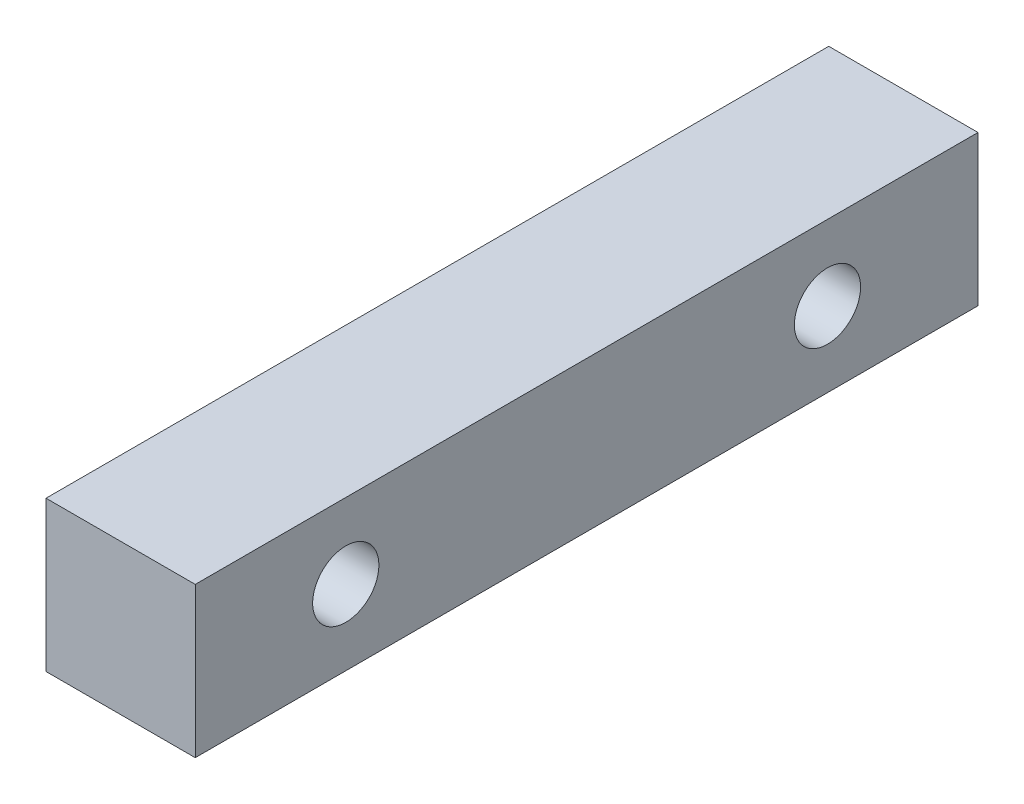
ISO-10303-21;
HEADER;
FILE_DESCRIPTION(('STEP AP214'),'2;1');
FILE_NAME('part.step','',(''),(''),'','','');
FILE_SCHEMA(('AUTOMOTIVE_DESIGN { 1 0 10303 214 1 1 1 1 }'));
ENDSEC;
DATA;
#1=APPLICATION_CONTEXT('core data for automotive mechanical design processes');
#2=APPLICATION_PROTOCOL_DEFINITION('international standard','automotive_design',2000,#1);
#3=PRODUCT_CONTEXT('',#1,'mechanical');
#4=PRODUCT('Part','Part','',(#3));
#5=PRODUCT_RELATED_PRODUCT_CATEGORY('part','',(#4));
#6=PRODUCT_DEFINITION_FORMATION('','',#4);
#7=PRODUCT_DEFINITION_CONTEXT('part definition',#1,'design');
#8=PRODUCT_DEFINITION('design','',#6,#7);
#9=PRODUCT_DEFINITION_SHAPE('','',#8);
#10=(LENGTH_UNIT() NAMED_UNIT(*) SI_UNIT(.MILLI.,.METRE.));
#11=(NAMED_UNIT(*) PLANE_ANGLE_UNIT() SI_UNIT($,.RADIAN.));
#12=(NAMED_UNIT(*) SI_UNIT($,.STERADIAN.) SOLID_ANGLE_UNIT());
#13=UNCERTAINTY_MEASURE_WITH_UNIT(LENGTH_MEASURE(1.E-05),#10,'distance_accuracy_value','');
#14=(GEOMETRIC_REPRESENTATION_CONTEXT(3) GLOBAL_UNCERTAINTY_ASSIGNED_CONTEXT((#13)) GLOBAL_UNIT_ASSIGNED_CONTEXT((#10,
#11,#12)) REPRESENTATION_CONTEXT('',''));
#15=CARTESIAN_POINT('',(0.,0.,0.));
#16=DIRECTION('',(0.,0.,1.));
#17=DIRECTION('',(1.,0.,0.));
#18=AXIS2_PLACEMENT_3D('',#15,#16,#17);
#19=CARTESIAN_POINT('',(0.,0.,-65.));
#20=DIRECTION('',(0.,0.,-1.));
#21=DIRECTION('',(-1.,0.,0.));
#22=AXIS2_PLACEMENT_3D('',#19,#20,#21);
#23=PLANE('',#22);
#24=DIRECTION('',(0.,-1.,0.));
#25=VECTOR('',#24,1.);
#26=CARTESIAN_POINT('',(-42.4,120.65,-65.));
#27=LINE('',#26,#25);
#28=CARTESIAN_POINT('',(-42.4,120.65,-65.));
#29=VERTEX_POINT('',#28);
#30=CARTESIAN_POINT('',(-42.4,108.185446869956,-65.));
#31=VERTEX_POINT('',#30);
#32=EDGE_CURVE('E46',#29,#31,#27,.T.);
#33=ORIENTED_EDGE('',*,*,#32,.F.);
#34=DIRECTION('',(-1.,0.,0.));
#35=VECTOR('',#34,1.);
#36=CARTESIAN_POINT('',(-42.4,120.65,-65.));
#37=LINE('',#36,#35);
#38=CARTESIAN_POINT('',(-30.0057262482,120.65,-65.));
#39=VERTEX_POINT('',#38);
#40=EDGE_CURVE('E70',#39,#29,#37,.T.);
#41=ORIENTED_EDGE('',*,*,#40,.F.);
#42=DIRECTION('',(0.,1.,0.));
#43=VECTOR('',#42,1.);
#44=CARTESIAN_POINT('',(-30.0057262482,120.65,-65.));
#45=LINE('',#44,#43);
#46=CARTESIAN_POINT('',(-30.0057262482,108.185446869956,-65.));
#47=VERTEX_POINT('',#46);
#48=EDGE_CURVE('E75',#47,#39,#45,.T.);
#49=ORIENTED_EDGE('',*,*,#48,.F.);
#50=DIRECTION('',(1.,0.,0.));
#51=VECTOR('',#50,1.);
#52=CARTESIAN_POINT('',(-42.4,108.185446869956,-65.));
#53=LINE('',#52,#51);
#54=EDGE_CURVE('E90',#31,#47,#53,.T.);
#55=ORIENTED_EDGE('',*,*,#54,.F.);
#56=EDGE_LOOP('',(#33,#41,#49,#55));
#57=FACE_BOUND('',#56,.T.);
#58=ADVANCED_FACE('F37',(#57),#23,.T.);
#59=CARTESIAN_POINT('',(0.,0.,0.));
#60=DIRECTION('',(0.,0.,1.));
#61=DIRECTION('',(1.,0.,0.));
#62=AXIS2_PLACEMENT_3D('',#59,#60,#61);
#63=PLANE('',#62);
#64=DIRECTION('',(0.,-1.,0.));
#65=VECTOR('',#64,1.);
#66=CARTESIAN_POINT('',(-42.4,120.65,0.));
#67=LINE('',#66,#65);
#68=CARTESIAN_POINT('',(-42.4,120.65,0.));
#69=VERTEX_POINT('',#68);
#70=CARTESIAN_POINT('',(-42.4,108.185446869956,0.));
#71=VERTEX_POINT('',#70);
#72=EDGE_CURVE('E100',#69,#71,#67,.T.);
#73=ORIENTED_EDGE('',*,*,#72,.T.);
#74=DIRECTION('',(1.,0.,0.));
#75=VECTOR('',#74,1.);
#76=CARTESIAN_POINT('',(-42.4,108.185446869956,0.));
#77=LINE('',#76,#75);
#78=CARTESIAN_POINT('',(-30.0057262482,108.185446869956,0.));
#79=VERTEX_POINT('',#78);
#80=EDGE_CURVE('E88',#71,#79,#77,.T.);
#81=ORIENTED_EDGE('',*,*,#80,.T.);
#82=DIRECTION('',(0.,1.,0.));
#83=VECTOR('',#82,1.);
#84=CARTESIAN_POINT('',(-30.0057262482,120.65,0.));
#85=LINE('',#84,#83);
#86=CARTESIAN_POINT('',(-30.0057262482,120.65,0.));
#87=VERTEX_POINT('',#86);
#88=EDGE_CURVE('E92',#79,#87,#85,.T.);
#89=ORIENTED_EDGE('',*,*,#88,.T.);
#90=DIRECTION('',(-1.,0.,0.));
#91=VECTOR('',#90,1.);
#92=CARTESIAN_POINT('',(-42.4,120.65,0.));
#93=LINE('',#92,#91);
#94=EDGE_CURVE('E97',#87,#69,#93,.T.);
#95=ORIENTED_EDGE('',*,*,#94,.T.);
#96=EDGE_LOOP('',(#73,#81,#89,#95));
#97=FACE_BOUND('',#96,.T.);
#98=ADVANCED_FACE('F99',(#97),#63,.T.);
#99=CARTESIAN_POINT('',(-42.4,108.185446869956,-82.577915307745));
#100=DIRECTION('',(0.,-1.,0.));
#101=DIRECTION('',(0.,0.,-1.));
#102=AXIS2_PLACEMENT_3D('',#99,#100,#101);
#103=PLANE('',#102);
#104=DIRECTION('',(0.,0.,1.));
#105=VECTOR('',#104,1.);
#106=CARTESIAN_POINT('',(-42.4,108.185446869956,-82.577915307745));
#107=LINE('',#106,#105);
#108=EDGE_CURVE('E11',#31,#71,#107,.T.);
#109=ORIENTED_EDGE('',*,*,#108,.F.);
#110=ORIENTED_EDGE('',*,*,#54,.T.);
#111=DIRECTION('',(0.,0.,1.));
#112=VECTOR('',#111,1.);
#113=CARTESIAN_POINT('',(-30.0057262482,108.185446869956,-82.577915307745));
#114=LINE('',#113,#112);
#115=EDGE_CURVE('E85',#47,#79,#114,.T.);
#116=ORIENTED_EDGE('',*,*,#115,.T.);
#117=ORIENTED_EDGE('',*,*,#80,.F.);
#118=EDGE_LOOP('',(#109,#110,#116,#117));
#119=FACE_BOUND('',#118,.T.);
#120=ADVANCED_FACE('F86',(#119),#103,.T.);
#121=CARTESIAN_POINT('',(-30.0057262482,120.65,-82.577915307745));
#122=DIRECTION('',(1.,0.,0.));
#123=DIRECTION('',(0.,0.,-1.));
#124=AXIS2_PLACEMENT_3D('',#121,#122,#123);
#125=PLANE('',#124);
#126=CARTESIAN_POINT('',(-30.0057262482,114.417723434978,-52.5));
#127=DIRECTION('',(1.,0.,0.));
#128=DIRECTION('',(0.,0.,-1.));
#129=AXIS2_PLACEMENT_3D('',#126,#127,#128);
#130=CIRCLE('',#129,2.75);
#131=CARTESIAN_POINT('',(-30.0057262482,114.417723434978,-55.25));
#132=VERTEX_POINT('',#131);
#133=EDGE_CURVE('E102',#132,#132,#130,.F.);
#134=ORIENTED_EDGE('',*,*,#133,.T.);
#135=EDGE_LOOP('',(#134));
#136=FACE_BOUND('',#135,.T.);
#137=CARTESIAN_POINT('',(-30.0057262482,114.417723434978,-12.5));
#138=DIRECTION('',(1.,0.,0.));
#139=DIRECTION('',(0.,0.,-1.));
#140=AXIS2_PLACEMENT_3D('',#137,#138,#139);
#141=CIRCLE('',#140,2.75);
#142=CARTESIAN_POINT('',(-30.0057262482,114.417723434978,-15.25));
#143=VERTEX_POINT('',#142);
#144=EDGE_CURVE('E114',#143,#143,#141,.F.);
#145=ORIENTED_EDGE('',*,*,#144,.T.);
#146=EDGE_LOOP('',(#145));
#147=FACE_BOUND('',#146,.T.);
#148=ORIENTED_EDGE('',*,*,#115,.F.);
#149=ORIENTED_EDGE('',*,*,#48,.T.);
#150=DIRECTION('',(0.,0.,1.));
#151=VECTOR('',#150,1.);
#152=CARTESIAN_POINT('',(-30.0057262482,120.65,-82.577915307745));
#153=LINE('',#152,#151);
#154=EDGE_CURVE('E80',#39,#87,#153,.T.);
#155=ORIENTED_EDGE('',*,*,#154,.T.);
#156=ORIENTED_EDGE('',*,*,#88,.F.);
#157=EDGE_LOOP('',(#148,#149,#155,#156));
#158=FACE_BOUND('',#157,.T.);
#159=ADVANCED_FACE('F93',(#136,#147,#158),#125,.T.);
#160=CARTESIAN_POINT('',(-42.4,120.65,-82.577915307745));
#161=DIRECTION('',(0.,1.,0.));
#162=DIRECTION('',(0.,0.,1.));
#163=AXIS2_PLACEMENT_3D('',#160,#161,#162);
#164=PLANE('',#163);
#165=ORIENTED_EDGE('',*,*,#154,.F.);
#166=ORIENTED_EDGE('',*,*,#40,.T.);
#167=DIRECTION('',(0.,0.,1.));
#168=VECTOR('',#167,1.);
#169=CARTESIAN_POINT('',(-42.4,120.65,-82.577915307745));
#170=LINE('',#169,#168);
#171=EDGE_CURVE('E108',#29,#69,#170,.T.);
#172=ORIENTED_EDGE('',*,*,#171,.T.);
#173=ORIENTED_EDGE('',*,*,#94,.F.);
#174=EDGE_LOOP('',(#165,#166,#172,#173));
#175=FACE_BOUND('',#174,.T.);
#176=ADVANCED_FACE('F125',(#175),#164,.T.);
#177=CARTESIAN_POINT('',(-42.4,120.65,-82.577915307745));
#178=DIRECTION('',(-1.,0.,0.));
#179=DIRECTION('',(0.,0.,1.));
#180=AXIS2_PLACEMENT_3D('',#177,#178,#179);
#181=PLANE('',#180);
#182=CARTESIAN_POINT('',(-42.4,114.417723434978,-52.5));
#183=DIRECTION('',(-1.,0.,0.));
#184=DIRECTION('',(0.,0.,1.));
#185=AXIS2_PLACEMENT_3D('',#182,#183,#184);
#186=CIRCLE('',#185,2.75);
#187=CARTESIAN_POINT('',(-42.4,114.417723434978,-49.75));
#188=VERTEX_POINT('',#187);
#189=EDGE_CURVE('E40',#188,#188,#186,.F.);
#190=ORIENTED_EDGE('',*,*,#189,.T.);
#191=EDGE_LOOP('',(#190));
#192=FACE_BOUND('',#191,.T.);
#193=CARTESIAN_POINT('',(-42.4,114.417723434978,-12.5));
#194=DIRECTION('',(-1.,0.,0.));
#195=DIRECTION('',(0.,0.,1.));
#196=AXIS2_PLACEMENT_3D('',#193,#194,#195);
#197=CIRCLE('',#196,2.75);
#198=CARTESIAN_POINT('',(-42.4,114.417723434978,-9.74999999999999));
#199=VERTEX_POINT('',#198);
#200=EDGE_CURVE('E112',#199,#199,#197,.F.);
#201=ORIENTED_EDGE('',*,*,#200,.T.);
#202=EDGE_LOOP('',(#201));
#203=FACE_BOUND('',#202,.T.);
#204=ORIENTED_EDGE('',*,*,#171,.F.);
#205=ORIENTED_EDGE('',*,*,#32,.T.);
#206=ORIENTED_EDGE('',*,*,#108,.T.);
#207=ORIENTED_EDGE('',*,*,#72,.F.);
#208=EDGE_LOOP('',(#204,#205,#206,#207));
#209=FACE_BOUND('',#208,.T.);
#210=ADVANCED_FACE('F127',(#192,#203,#209),#181,.T.);
#211=CARTESIAN_POINT('',(-54.940674593052,114.417723434978,-12.5));
#212=DIRECTION('',(1.,0.,0.));
#213=DIRECTION('',(0.,0.,-1.));
#214=AXIS2_PLACEMENT_3D('',#211,#212,#213);
#215=CYLINDRICAL_SURFACE('',#214,2.75);
#216=ORIENTED_EDGE('',*,*,#144,.F.);
#217=EDGE_LOOP('',(#216));
#218=FACE_BOUND('',#217,.T.);
#219=ORIENTED_EDGE('',*,*,#200,.F.);
#220=EDGE_LOOP('',(#219));
#221=FACE_BOUND('',#220,.T.);
#222=ADVANCED_FACE('F129',(#218,#221),#215,.F.);
#223=CARTESIAN_POINT('',(-54.940674593052,114.417723434978,-52.5));
#224=DIRECTION('',(1.,0.,0.));
#225=DIRECTION('',(0.,0.,-1.));
#226=AXIS2_PLACEMENT_3D('',#223,#224,#225);
#227=CYLINDRICAL_SURFACE('',#226,2.75);
#228=ORIENTED_EDGE('',*,*,#133,.F.);
#229=EDGE_LOOP('',(#228));
#230=FACE_BOUND('',#229,.T.);
#231=ORIENTED_EDGE('',*,*,#189,.F.);
#232=EDGE_LOOP('',(#231));
#233=FACE_BOUND('',#232,.T.);
#234=ADVANCED_FACE('F136',(#230,#233),#227,.F.);
#235=CLOSED_SHELL('',(#58,#98,#120,#159,#176,#210,#222,#234));
#236=MANIFOLD_SOLID_BREP('B2',#235);
#237=ADVANCED_BREP_SHAPE_REPRESENTATION('',(#18,#236),#14);
#238=SHAPE_DEFINITION_REPRESENTATION(#9,#237);
ENDSEC;
END-ISO-10303-21;
